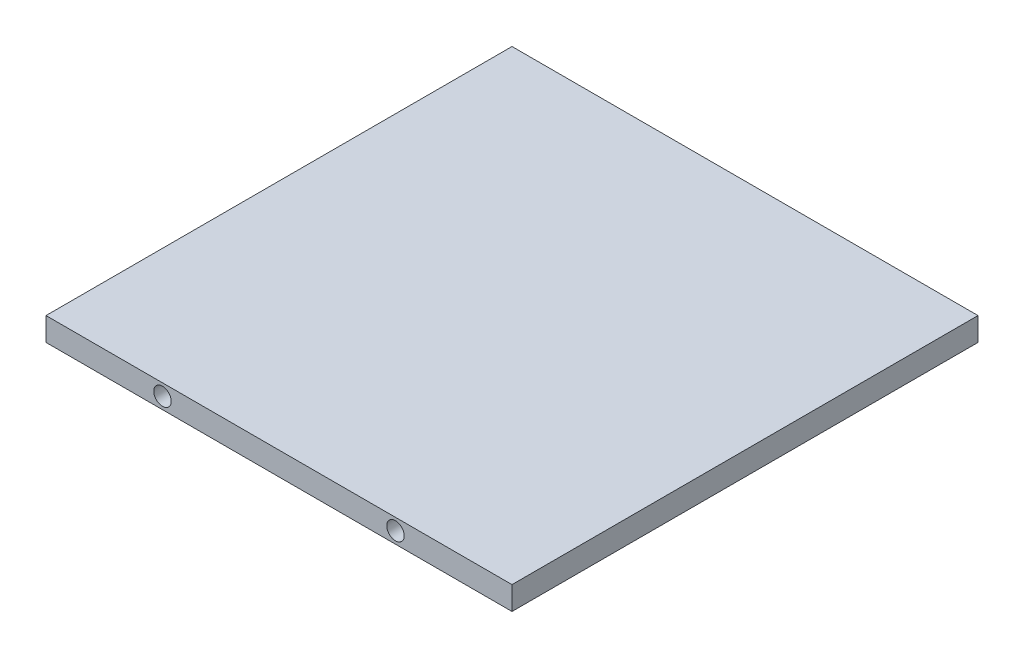
ISO-10303-21;
HEADER;
FILE_DESCRIPTION(('STEP AP214'),'2;1');
FILE_NAME('part.step','',(''),(''),'','','');
FILE_SCHEMA(('AUTOMOTIVE_DESIGN { 1 0 10303 214 1 1 1 1 }'));
ENDSEC;
DATA;
#1=APPLICATION_CONTEXT('core data for automotive mechanical design processes');
#2=APPLICATION_PROTOCOL_DEFINITION('international standard','automotive_design',2000,#1);
#3=PRODUCT_CONTEXT('',#1,'mechanical');
#4=PRODUCT('Part','Part','',(#3));
#5=PRODUCT_RELATED_PRODUCT_CATEGORY('part','',(#4));
#6=PRODUCT_DEFINITION_FORMATION('','',#4);
#7=PRODUCT_DEFINITION_CONTEXT('part definition',#1,'design');
#8=PRODUCT_DEFINITION('design','',#6,#7);
#9=PRODUCT_DEFINITION_SHAPE('','',#8);
#10=(LENGTH_UNIT() NAMED_UNIT(*) SI_UNIT(.MILLI.,.METRE.));
#11=(NAMED_UNIT(*) PLANE_ANGLE_UNIT() SI_UNIT($,.RADIAN.));
#12=(NAMED_UNIT(*) SI_UNIT($,.STERADIAN.) SOLID_ANGLE_UNIT());
#13=UNCERTAINTY_MEASURE_WITH_UNIT(LENGTH_MEASURE(1.E-05),#10,'distance_accuracy_value','');
#14=(GEOMETRIC_REPRESENTATION_CONTEXT(3) GLOBAL_UNCERTAINTY_ASSIGNED_CONTEXT((#13)) GLOBAL_UNIT_ASSIGNED_CONTEXT((#10,
#11,#12)) REPRESENTATION_CONTEXT('',''));
#15=CARTESIAN_POINT('',(0.,0.,0.));
#16=DIRECTION('',(0.,0.,1.));
#17=DIRECTION('',(1.,0.,0.));
#18=AXIS2_PLACEMENT_3D('',#15,#16,#17);
#19=CARTESIAN_POINT('',(80.,-2.,0.));
#20=DIRECTION('',(0.,-1.,0.));
#21=DIRECTION('',(0.,0.,-1.));
#22=AXIS2_PLACEMENT_3D('',#19,#20,#21);
#23=PLANE('',#22);
#24=DIRECTION('',(0.,0.,1.));
#25=VECTOR('',#24,1.);
#26=CARTESIAN_POINT('',(40.,-2.,0.));
#27=LINE('',#26,#25);
#28=CARTESIAN_POINT('',(40.,-2.,-70.0000000000007));
#29=VERTEX_POINT('',#28);
#30=CARTESIAN_POINT('',(40.,-2.,-30.0000000000007));
#31=VERTEX_POINT('',#30);
#32=EDGE_CURVE('E85',#29,#31,#27,.T.);
#33=ORIENTED_EDGE('',*,*,#32,.T.);
#34=DIRECTION('',(1.,0.,0.));
#35=VECTOR('',#34,1.);
#36=CARTESIAN_POINT('',(0.,-2.,-30.0000000000007));
#37=LINE('',#36,#35);
#38=CARTESIAN_POINT('',(0.,-2.,-30.0000000000007));
#39=VERTEX_POINT('',#38);
#40=EDGE_CURVE('E89',#39,#31,#37,.T.);
#41=ORIENTED_EDGE('',*,*,#40,.F.);
#42=DIRECTION('',(0.,0.,1.));
#43=VECTOR('',#42,1.);
#44=CARTESIAN_POINT('',(0.,-2.,0.));
#45=LINE('',#44,#43);
#46=CARTESIAN_POINT('',(0.,-1.99999999999999,-70.0000000000007));
#47=VERTEX_POINT('',#46);
#48=EDGE_CURVE('E93',#47,#39,#45,.T.);
#49=ORIENTED_EDGE('',*,*,#48,.F.);
#50=DIRECTION('',(1.,0.,0.));
#51=VECTOR('',#50,1.);
#52=CARTESIAN_POINT('',(0.,-2.,-70.0000000000007));
#53=LINE('',#52,#51);
#54=EDGE_CURVE('E53',#47,#29,#53,.T.);
#55=ORIENTED_EDGE('',*,*,#54,.T.);
#56=EDGE_LOOP('',(#33,#41,#49,#55));
#57=FACE_BOUND('',#56,.T.);
#58=ADVANCED_FACE('F39',(#57),#23,.T.);
#59=CARTESIAN_POINT('',(80.,0.,0.));
#60=DIRECTION('',(0.,1.,0.));
#61=DIRECTION('',(0.,0.,1.));
#62=AXIS2_PLACEMENT_3D('',#59,#60,#61);
#63=PLANE('',#62);
#64=DIRECTION('',(0.,0.,-1.));
#65=VECTOR('',#64,1.);
#66=CARTESIAN_POINT('',(0.,0.,0.));
#67=LINE('',#66,#65);
#68=CARTESIAN_POINT('',(0.,0.,-30.0000000000007));
#69=VERTEX_POINT('',#68);
#70=CARTESIAN_POINT('',(0.,0.,-70.0000000000007));
#71=VERTEX_POINT('',#70);
#72=EDGE_CURVE('E46',#69,#71,#67,.T.);
#73=ORIENTED_EDGE('',*,*,#72,.F.);
#74=DIRECTION('',(1.,0.,0.));
#75=VECTOR('',#74,1.);
#76=CARTESIAN_POINT('',(80.,0.,-30.0000000000007));
#77=LINE('',#76,#75);
#78=CARTESIAN_POINT('',(40.,0.,-30.0000000000007));
#79=VERTEX_POINT('',#78);
#80=EDGE_CURVE('E110',#69,#79,#77,.T.);
#81=ORIENTED_EDGE('',*,*,#80,.T.);
#82=DIRECTION('',(0.,0.,1.));
#83=VECTOR('',#82,1.);
#84=CARTESIAN_POINT('',(40.,0.,0.));
#85=LINE('',#84,#83);
#86=CARTESIAN_POINT('',(40.,0.,-70.0000000000007));
#87=VERTEX_POINT('',#86);
#88=EDGE_CURVE('E11',#87,#79,#85,.T.);
#89=ORIENTED_EDGE('',*,*,#88,.F.);
#90=DIRECTION('',(1.,0.,0.));
#91=VECTOR('',#90,1.);
#92=CARTESIAN_POINT('',(80.,0.,-70.0000000000007));
#93=LINE('',#92,#91);
#94=EDGE_CURVE('E80',#71,#87,#93,.T.);
#95=ORIENTED_EDGE('',*,*,#94,.F.);
#96=EDGE_LOOP('',(#73,#81,#89,#95));
#97=FACE_BOUND('',#96,.T.);
#98=ADVANCED_FACE('F118',(#97),#63,.T.);
#99=CARTESIAN_POINT('',(0.,0.,0.));
#100=DIRECTION('',(1.,0.,0.));
#101=DIRECTION('',(0.,0.,-1.));
#102=AXIS2_PLACEMENT_3D('',#99,#100,#101);
#103=PLANE('',#102);
#104=CARTESIAN_POINT('',(0.,-0.999999999999999,-60.0000000000007));
#105=DIRECTION('',(-1.,0.,0.));
#106=DIRECTION('',(0.,0.,1.));
#107=AXIS2_PLACEMENT_3D('',#104,#105,#106);
#108=CIRCLE('',#107,0.750000000000002);
#109=CARTESIAN_POINT('',(0.,-0.999999999999999,-59.2500000000007));
#110=VERTEX_POINT('',#109);
#111=EDGE_CURVE('E179',#110,#110,#108,.T.);
#112=ORIENTED_EDGE('',*,*,#111,.F.);
#113=EDGE_LOOP('',(#112));
#114=FACE_BOUND('',#113,.T.);
#115=CARTESIAN_POINT('',(0.,-0.999999999999997,-40.0000000000007));
#116=DIRECTION('',(-1.,0.,0.));
#117=DIRECTION('',(0.,0.,1.));
#118=AXIS2_PLACEMENT_3D('',#115,#116,#117);
#119=CIRCLE('',#118,0.75);
#120=CARTESIAN_POINT('',(0.,-0.999999999999997,-39.2500000000007));
#121=VERTEX_POINT('',#120);
#122=EDGE_CURVE('E173',#121,#121,#119,.T.);
#123=ORIENTED_EDGE('',*,*,#122,.F.);
#124=EDGE_LOOP('',(#123));
#125=FACE_BOUND('',#124,.T.);
#126=DIRECTION('',(0.,1.,0.));
#127=VECTOR('',#126,1.);
#128=CARTESIAN_POINT('',(0.,-2.,-30.0000000000007));
#129=LINE('',#128,#127);
#130=EDGE_CURVE('E104',#39,#69,#129,.T.);
#131=ORIENTED_EDGE('',*,*,#130,.T.);
#132=ORIENTED_EDGE('',*,*,#72,.T.);
#133=DIRECTION('',(0.,1.,0.));
#134=VECTOR('',#133,1.);
#135=CARTESIAN_POINT('',(0.,-2.,-70.0000000000007));
#136=LINE('',#135,#134);
#137=EDGE_CURVE('E82',#47,#71,#136,.T.);
#138=ORIENTED_EDGE('',*,*,#137,.F.);
#139=ORIENTED_EDGE('',*,*,#48,.T.);
#140=EDGE_LOOP('',(#131,#132,#138,#139));
#141=FACE_BOUND('',#140,.T.);
#142=ADVANCED_FACE('F116',(#114,#125,#141),#103,.F.);
#143=CARTESIAN_POINT('',(0.,-2.,-30.0000000000007));
#144=DIRECTION('',(0.,0.,1.));
#145=DIRECTION('',(1.,0.,0.));
#146=AXIS2_PLACEMENT_3D('',#143,#144,#145);
#147=PLANE('',#146);
#148=CARTESIAN_POINT('',(9.99999999999999,-0.999999999999999,-30.0000000000007));
#149=DIRECTION('',(0.,0.,1.));
#150=DIRECTION('',(1.,0.,0.));
#151=AXIS2_PLACEMENT_3D('',#148,#149,#150);
#152=CIRCLE('',#151,0.750000000000002);
#153=CARTESIAN_POINT('',(10.75,-0.999999999999999,-30.0000000000007));
#154=VERTEX_POINT('',#153);
#155=EDGE_CURVE('E167',#154,#154,#152,.T.);
#156=ORIENTED_EDGE('',*,*,#155,.F.);
#157=EDGE_LOOP('',(#156));
#158=FACE_BOUND('',#157,.T.);
#159=CARTESIAN_POINT('',(30.,-0.999999999999997,-30.0000000000007));
#160=DIRECTION('',(0.,0.,1.));
#161=DIRECTION('',(1.,0.,0.));
#162=AXIS2_PLACEMENT_3D('',#159,#160,#161);
#163=CIRCLE('',#162,0.75);
#164=CARTESIAN_POINT('',(30.75,-0.999999999999997,-30.0000000000007));
#165=VERTEX_POINT('',#164);
#166=EDGE_CURVE('E161',#165,#165,#163,.T.);
#167=ORIENTED_EDGE('',*,*,#166,.F.);
#168=EDGE_LOOP('',(#167));
#169=FACE_BOUND('',#168,.T.);
#170=ORIENTED_EDGE('',*,*,#130,.F.);
#171=ORIENTED_EDGE('',*,*,#40,.T.);
#172=DIRECTION('',(0.,1.,0.));
#173=VECTOR('',#172,1.);
#174=CARTESIAN_POINT('',(40.,-2.,-30.0000000000007));
#175=LINE('',#174,#173);
#176=EDGE_CURVE('E81',#31,#79,#175,.T.);
#177=ORIENTED_EDGE('',*,*,#176,.T.);
#178=ORIENTED_EDGE('',*,*,#80,.F.);
#179=EDGE_LOOP('',(#170,#171,#177,#178));
#180=FACE_BOUND('',#179,.T.);
#181=ADVANCED_FACE('F120',(#158,#169,#180),#147,.T.);
#182=CARTESIAN_POINT('',(40.,-2.,0.));
#183=DIRECTION('',(-1.,0.,0.));
#184=DIRECTION('',(0.,0.,1.));
#185=AXIS2_PLACEMENT_3D('',#182,#183,#184);
#186=PLANE('',#185);
#187=ORIENTED_EDGE('',*,*,#88,.T.);
#188=ORIENTED_EDGE('',*,*,#176,.F.);
#189=ORIENTED_EDGE('',*,*,#32,.F.);
#190=DIRECTION('',(0.,1.,0.));
#191=VECTOR('',#190,1.);
#192=CARTESIAN_POINT('',(40.,-2.,-70.0000000000007));
#193=LINE('',#192,#191);
#194=EDGE_CURVE('E76',#29,#87,#193,.T.);
#195=ORIENTED_EDGE('',*,*,#194,.T.);
#196=EDGE_LOOP('',(#187,#188,#189,#195));
#197=FACE_BOUND('',#196,.T.);
#198=ADVANCED_FACE('F86',(#197),#186,.F.);
#199=CARTESIAN_POINT('',(0.,-2.,-70.0000000000007));
#200=DIRECTION('',(0.,0.,1.));
#201=DIRECTION('',(1.,0.,0.));
#202=AXIS2_PLACEMENT_3D('',#199,#200,#201);
#203=PLANE('',#202);
#204=CARTESIAN_POINT('',(30.,-0.999999999999999,-70.0000000000007));
#205=DIRECTION('',(0.,0.,-1.));
#206=DIRECTION('',(-1.,0.,0.));
#207=AXIS2_PLACEMENT_3D('',#204,#205,#206);
#208=CIRCLE('',#207,0.750000000000002);
#209=CARTESIAN_POINT('',(29.25,-0.999999999999999,-70.0000000000007));
#210=VERTEX_POINT('',#209);
#211=EDGE_CURVE('E97',#210,#210,#208,.T.);
#212=ORIENTED_EDGE('',*,*,#211,.F.);
#213=EDGE_LOOP('',(#212));
#214=FACE_BOUND('',#213,.T.);
#215=CARTESIAN_POINT('',(9.99999999999999,-0.999999999999997,-70.0000000000007));
#216=DIRECTION('',(0.,0.,-1.));
#217=DIRECTION('',(-1.,0.,0.));
#218=AXIS2_PLACEMENT_3D('',#215,#216,#217);
#219=CIRCLE('',#218,0.75);
#220=CARTESIAN_POINT('',(9.24999999999999,-0.999999999999997,-70.0000000000007));
#221=VERTEX_POINT('',#220);
#222=EDGE_CURVE('E155',#221,#221,#219,.T.);
#223=ORIENTED_EDGE('',*,*,#222,.F.);
#224=EDGE_LOOP('',(#223));
#225=FACE_BOUND('',#224,.T.);
#226=ORIENTED_EDGE('',*,*,#94,.T.);
#227=ORIENTED_EDGE('',*,*,#194,.F.);
#228=ORIENTED_EDGE('',*,*,#54,.F.);
#229=ORIENTED_EDGE('',*,*,#137,.T.);
#230=EDGE_LOOP('',(#226,#227,#228,#229));
#231=FACE_BOUND('',#230,.T.);
#232=ADVANCED_FACE('F78',(#214,#225,#231),#203,.F.);
#233=CARTESIAN_POINT('',(9.99999999999999,-0.999999999999997,-65.0000000000007));
#234=DIRECTION('',(0.,0.,-1.));
#235=DIRECTION('',(-1.,0.,0.));
#236=AXIS2_PLACEMENT_3D('',#233,#234,#235);
#237=CYLINDRICAL_SURFACE('',#236,0.75);
#238=CARTESIAN_POINT('',(9.99999999999999,-0.999999999999997,-65.0000000000007));
#239=DIRECTION('',(0.,0.,-1.));
#240=DIRECTION('',(-1.,0.,0.));
#241=AXIS2_PLACEMENT_3D('',#238,#239,#240);
#242=CIRCLE('',#241,0.75);
#243=CARTESIAN_POINT('',(9.24999999999999,-0.999999999999997,-65.0000000000007));
#244=VERTEX_POINT('',#243);
#245=EDGE_CURVE('E100',#244,#244,#242,.T.);
#246=ORIENTED_EDGE('',*,*,#245,.F.);
#247=EDGE_LOOP('',(#246));
#248=FACE_BOUND('',#247,.T.);
#249=ORIENTED_EDGE('',*,*,#222,.T.);
#250=EDGE_LOOP('',(#249));
#251=FACE_BOUND('',#250,.T.);
#252=ADVANCED_FACE('F142',(#248,#251),#237,.F.);
#253=CARTESIAN_POINT('',(9.99999999999999,-0.999999999999997,-65.0000000000007));
#254=DIRECTION('',(0.,0.,-1.));
#255=DIRECTION('',(-1.,0.,0.));
#256=AXIS2_PLACEMENT_3D('',#253,#254,#255);
#257=PLANE('',#256);
#258=ORIENTED_EDGE('',*,*,#245,.T.);
#259=EDGE_LOOP('',(#258));
#260=FACE_BOUND('',#259,.T.);
#261=ADVANCED_FACE('F147',(#260),#257,.T.);
#262=CARTESIAN_POINT('',(30.,-0.999999999999999,-65.0000000000007));
#263=DIRECTION('',(0.,0.,-1.));
#264=DIRECTION('',(-1.,0.,0.));
#265=AXIS2_PLACEMENT_3D('',#262,#263,#264);
#266=CYLINDRICAL_SURFACE('',#265,0.750000000000002);
#267=CARTESIAN_POINT('',(30.,-0.999999999999999,-65.0000000000007));
#268=DIRECTION('',(0.,0.,-1.));
#269=DIRECTION('',(-1.,0.,0.));
#270=AXIS2_PLACEMENT_3D('',#267,#268,#269);
#271=CIRCLE('',#270,0.750000000000002);
#272=CARTESIAN_POINT('',(29.25,-0.999999999999999,-65.0000000000007));
#273=VERTEX_POINT('',#272);
#274=EDGE_CURVE('E94',#273,#273,#271,.T.);
#275=ORIENTED_EDGE('',*,*,#274,.F.);
#276=EDGE_LOOP('',(#275));
#277=FACE_BOUND('',#276,.T.);
#278=ORIENTED_EDGE('',*,*,#211,.T.);
#279=EDGE_LOOP('',(#278));
#280=FACE_BOUND('',#279,.T.);
#281=ADVANCED_FACE('F226',(#277,#280),#266,.F.);
#282=CARTESIAN_POINT('',(30.,-0.999999999999999,-65.0000000000007));
#283=DIRECTION('',(0.,0.,-1.));
#284=DIRECTION('',(-1.,0.,0.));
#285=AXIS2_PLACEMENT_3D('',#282,#283,#284);
#286=PLANE('',#285);
#287=ORIENTED_EDGE('',*,*,#274,.T.);
#288=EDGE_LOOP('',(#287));
#289=FACE_BOUND('',#288,.T.);
#290=ADVANCED_FACE('F222',(#289),#286,.T.);
#291=CARTESIAN_POINT('',(30.,-0.999999999999997,-35.0000000000007));
#292=DIRECTION('',(0.,0.,1.));
#293=DIRECTION('',(1.,0.,0.));
#294=AXIS2_PLACEMENT_3D('',#291,#292,#293);
#295=CYLINDRICAL_SURFACE('',#294,0.75);
#296=CARTESIAN_POINT('',(30.,-0.999999999999997,-35.0000000000007));
#297=DIRECTION('',(0.,0.,1.));
#298=DIRECTION('',(1.,0.,0.));
#299=AXIS2_PLACEMENT_3D('',#296,#297,#298);
#300=CIRCLE('',#299,0.75);
#301=CARTESIAN_POINT('',(30.75,-0.999999999999997,-35.0000000000007));
#302=VERTEX_POINT('',#301);
#303=EDGE_CURVE('E164',#302,#302,#300,.T.);
#304=ORIENTED_EDGE('',*,*,#303,.F.);
#305=EDGE_LOOP('',(#304));
#306=FACE_BOUND('',#305,.T.);
#307=ORIENTED_EDGE('',*,*,#166,.T.);
#308=EDGE_LOOP('',(#307));
#309=FACE_BOUND('',#308,.T.);
#310=ADVANCED_FACE('F218',(#306,#309),#295,.F.);
#311=CARTESIAN_POINT('',(30.,-0.999999999999997,-35.0000000000007));
#312=DIRECTION('',(0.,0.,1.));
#313=DIRECTION('',(1.,0.,0.));
#314=AXIS2_PLACEMENT_3D('',#311,#312,#313);
#315=PLANE('',#314);
#316=ORIENTED_EDGE('',*,*,#303,.T.);
#317=EDGE_LOOP('',(#316));
#318=FACE_BOUND('',#317,.T.);
#319=ADVANCED_FACE('F214',(#318),#315,.T.);
#320=CARTESIAN_POINT('',(9.99999999999999,-0.999999999999999,-35.0000000000007));
#321=DIRECTION('',(0.,0.,1.));
#322=DIRECTION('',(1.,0.,0.));
#323=AXIS2_PLACEMENT_3D('',#320,#321,#322);
#324=CYLINDRICAL_SURFACE('',#323,0.750000000000002);
#325=CARTESIAN_POINT('',(9.99999999999999,-0.999999999999999,-35.0000000000007));
#326=DIRECTION('',(0.,0.,1.));
#327=DIRECTION('',(1.,0.,0.));
#328=AXIS2_PLACEMENT_3D('',#325,#326,#327);
#329=CIRCLE('',#328,0.750000000000002);
#330=CARTESIAN_POINT('',(10.75,-0.999999999999999,-35.0000000000007));
#331=VERTEX_POINT('',#330);
#332=EDGE_CURVE('E170',#331,#331,#329,.T.);
#333=ORIENTED_EDGE('',*,*,#332,.F.);
#334=EDGE_LOOP('',(#333));
#335=FACE_BOUND('',#334,.T.);
#336=ORIENTED_EDGE('',*,*,#155,.T.);
#337=EDGE_LOOP('',(#336));
#338=FACE_BOUND('',#337,.T.);
#339=ADVANCED_FACE('F207',(#335,#338),#324,.F.);
#340=CARTESIAN_POINT('',(9.99999999999999,-0.999999999999999,-35.0000000000007));
#341=DIRECTION('',(0.,0.,1.));
#342=DIRECTION('',(1.,0.,0.));
#343=AXIS2_PLACEMENT_3D('',#340,#341,#342);
#344=PLANE('',#343);
#345=ORIENTED_EDGE('',*,*,#332,.T.);
#346=EDGE_LOOP('',(#345));
#347=FACE_BOUND('',#346,.T.);
#348=ADVANCED_FACE('F198',(#347),#344,.T.);
#349=CARTESIAN_POINT('',(5.00000000000004,-0.999999999999997,-40.0000000000007));
#350=DIRECTION('',(-1.,0.,0.));
#351=DIRECTION('',(0.,0.,1.));
#352=AXIS2_PLACEMENT_3D('',#349,#350,#351);
#353=CYLINDRICAL_SURFACE('',#352,0.75);
#354=CARTESIAN_POINT('',(5.00000000000004,-0.999999999999997,-40.0000000000007));
#355=DIRECTION('',(-1.,0.,0.));
#356=DIRECTION('',(0.,0.,1.));
#357=AXIS2_PLACEMENT_3D('',#354,#355,#356);
#358=CIRCLE('',#357,0.75);
#359=CARTESIAN_POINT('',(5.00000000000004,-0.999999999999997,-39.2500000000007));
#360=VERTEX_POINT('',#359);
#361=EDGE_CURVE('E176',#360,#360,#358,.T.);
#362=ORIENTED_EDGE('',*,*,#361,.F.);
#363=EDGE_LOOP('',(#362));
#364=FACE_BOUND('',#363,.T.);
#365=ORIENTED_EDGE('',*,*,#122,.T.);
#366=EDGE_LOOP('',(#365));
#367=FACE_BOUND('',#366,.T.);
#368=ADVANCED_FACE('F196',(#364,#367),#353,.F.);
#369=CARTESIAN_POINT('',(5.00000000000004,-0.999999999999997,-40.0000000000007));
#370=DIRECTION('',(-1.,0.,0.));
#371=DIRECTION('',(0.,0.,1.));
#372=AXIS2_PLACEMENT_3D('',#369,#370,#371);
#373=PLANE('',#372);
#374=ORIENTED_EDGE('',*,*,#361,.T.);
#375=EDGE_LOOP('',(#374));
#376=FACE_BOUND('',#375,.T.);
#377=ADVANCED_FACE('F190',(#376),#373,.T.);
#378=CARTESIAN_POINT('',(4.99999999999997,-0.999999999999999,-60.0000000000007));
#379=DIRECTION('',(-1.,0.,0.));
#380=DIRECTION('',(0.,0.,1.));
#381=AXIS2_PLACEMENT_3D('',#378,#379,#380);
#382=CYLINDRICAL_SURFACE('',#381,0.750000000000002);
#383=CARTESIAN_POINT('',(4.99999999999997,-0.999999999999999,-60.0000000000007));
#384=DIRECTION('',(-1.,0.,0.));
#385=DIRECTION('',(0.,0.,1.));
#386=AXIS2_PLACEMENT_3D('',#383,#384,#385);
#387=CIRCLE('',#386,0.750000000000002);
#388=CARTESIAN_POINT('',(4.99999999999998,-0.999999999999999,-59.2500000000007));
#389=VERTEX_POINT('',#388);
#390=EDGE_CURVE('E159',#389,#389,#387,.T.);
#391=ORIENTED_EDGE('',*,*,#390,.F.);
#392=EDGE_LOOP('',(#391));
#393=FACE_BOUND('',#392,.T.);
#394=ORIENTED_EDGE('',*,*,#111,.T.);
#395=EDGE_LOOP('',(#394));
#396=FACE_BOUND('',#395,.T.);
#397=ADVANCED_FACE('F187',(#393,#396),#382,.F.);
#398=CARTESIAN_POINT('',(4.99999999999997,-0.999999999999999,-60.0000000000007));
#399=DIRECTION('',(-1.,0.,0.));
#400=DIRECTION('',(0.,0.,1.));
#401=AXIS2_PLACEMENT_3D('',#398,#399,#400);
#402=PLANE('',#401);
#403=ORIENTED_EDGE('',*,*,#390,.T.);
#404=EDGE_LOOP('',(#403));
#405=FACE_BOUND('',#404,.T.);
#406=ADVANCED_FACE('F185',(#405),#402,.T.);
#407=CLOSED_SHELL('',(#58,#98,#142,#181,#198,#232,#252,#261,#281,#290,#310,#319,#339,#348,#368,
#377,#397,#406));
#408=MANIFOLD_SOLID_BREP('B2',#407);
#409=ADVANCED_BREP_SHAPE_REPRESENTATION('',(#18,#408),#14);
#410=SHAPE_DEFINITION_REPRESENTATION(#9,#409);
ENDSEC;
END-ISO-10303-21;
